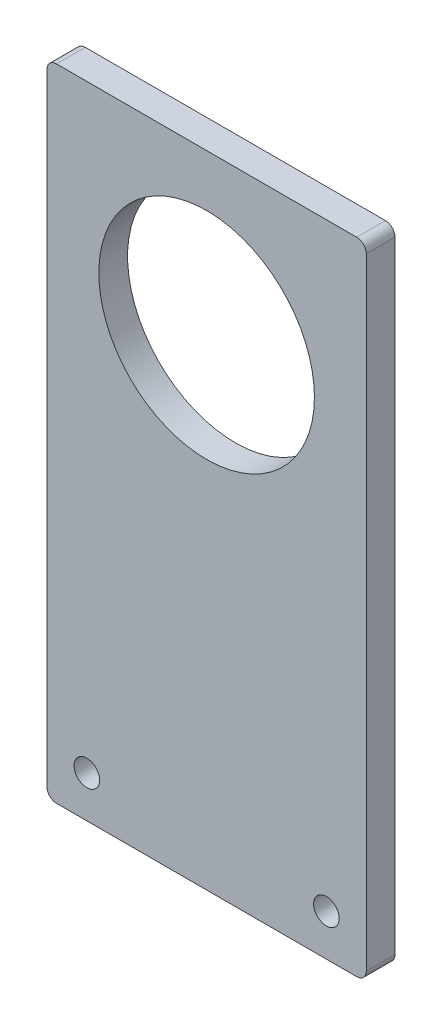
ISO-10303-21;
HEADER;
FILE_DESCRIPTION(('STEP AP214'),'2;1');
FILE_NAME('part.step','',(''),(''),'','','');
FILE_SCHEMA(('AUTOMOTIVE_DESIGN { 1 0 10303 214 1 1 1 1 }'));
ENDSEC;
DATA;
#1=APPLICATION_CONTEXT('core data for automotive mechanical design processes');
#2=APPLICATION_PROTOCOL_DEFINITION('international standard','automotive_design',2000,#1);
#3=PRODUCT_CONTEXT('',#1,'mechanical');
#4=PRODUCT('Part','Part','',(#3));
#5=PRODUCT_RELATED_PRODUCT_CATEGORY('part','',(#4));
#6=PRODUCT_DEFINITION_FORMATION('','',#4);
#7=PRODUCT_DEFINITION_CONTEXT('part definition',#1,'design');
#8=PRODUCT_DEFINITION('design','',#6,#7);
#9=PRODUCT_DEFINITION_SHAPE('','',#8);
#10=(LENGTH_UNIT() NAMED_UNIT(*) SI_UNIT(.MILLI.,.METRE.));
#11=(NAMED_UNIT(*) PLANE_ANGLE_UNIT() SI_UNIT($,.RADIAN.));
#12=(NAMED_UNIT(*) SI_UNIT($,.STERADIAN.) SOLID_ANGLE_UNIT());
#13=UNCERTAINTY_MEASURE_WITH_UNIT(LENGTH_MEASURE(1.E-05),#10,'distance_accuracy_value','');
#14=(GEOMETRIC_REPRESENTATION_CONTEXT(3) GLOBAL_UNCERTAINTY_ASSIGNED_CONTEXT((#13)) GLOBAL_UNIT_ASSIGNED_CONTEXT((#10,
#11,#12)) REPRESENTATION_CONTEXT('',''));
#15=CARTESIAN_POINT('',(0.,0.,0.));
#16=DIRECTION('',(0.,0.,1.));
#17=DIRECTION('',(1.,0.,0.));
#18=AXIS2_PLACEMENT_3D('',#15,#16,#17);
#19=CARTESIAN_POINT('',(19.5,-39.6,1.8));
#20=DIRECTION('',(0.,0.,1.));
#21=DIRECTION('',(1.,0.,0.));
#22=AXIS2_PLACEMENT_3D('',#19,#20,#21);
#23=PLANE('',#22);
#24=CARTESIAN_POINT('',(10.1,-10.1,1.8));
#25=DIRECTION('',(0.,0.,1.));
#26=DIRECTION('',(1.,0.,0.));
#27=AXIS2_PLACEMENT_3D('',#24,#25,#26);
#28=CIRCLE('',#27,6.75);
#29=CARTESIAN_POINT('',(16.85,-10.1,1.8));
#30=VERTEX_POINT('',#29);
#31=EDGE_CURVE('E11',#30,#30,#28,.T.);
#32=ORIENTED_EDGE('',*,*,#31,.F.);
#33=EDGE_LOOP('',(#32));
#34=FACE_BOUND('',#33,.T.);
#35=CARTESIAN_POINT('',(17.6,-37.6,1.8));
#36=DIRECTION('',(0.,0.,1.));
#37=DIRECTION('',(1.,0.,0.));
#38=AXIS2_PLACEMENT_3D('',#35,#36,#37);
#39=CIRCLE('',#38,0.8);
#40=CARTESIAN_POINT('',(18.4,-37.6,1.8));
#41=VERTEX_POINT('',#40);
#42=EDGE_CURVE('E183',#41,#41,#39,.T.);
#43=ORIENTED_EDGE('',*,*,#42,.F.);
#44=EDGE_LOOP('',(#43));
#45=FACE_BOUND('',#44,.T.);
#46=CARTESIAN_POINT('',(2.6,-37.6,1.8));
#47=DIRECTION('',(0.,0.,1.));
#48=DIRECTION('',(-1.,0.,0.));
#49=AXIS2_PLACEMENT_3D('',#46,#47,#48);
#50=CIRCLE('',#49,0.8);
#51=CARTESIAN_POINT('',(1.8,-37.6,1.8));
#52=VERTEX_POINT('',#51);
#53=EDGE_CURVE('E186',#52,#52,#50,.T.);
#54=ORIENTED_EDGE('',*,*,#53,.F.);
#55=EDGE_LOOP('',(#54));
#56=FACE_BOUND('',#55,.T.);
#57=DIRECTION('',(-1.,0.,0.));
#58=VECTOR('',#57,1.);
#59=CARTESIAN_POINT('',(19.5,-0.100000000000003,1.8));
#60=LINE('',#59,#58);
#61=CARTESIAN_POINT('',(19.5,-0.1,1.8));
#62=VERTEX_POINT('',#61);
#63=CARTESIAN_POINT('',(0.700000000000006,-0.100000000000003,1.8));
#64=VERTEX_POINT('',#63);
#65=EDGE_CURVE('E140',#62,#64,#60,.T.);
#66=ORIENTED_EDGE('',*,*,#65,.T.);
#67=CARTESIAN_POINT('',(0.7,-0.7,1.8));
#68=DIRECTION('',(0.,0.,1.));
#69=DIRECTION('',(1.,0.,0.));
#70=AXIS2_PLACEMENT_3D('',#67,#68,#69);
#71=CIRCLE('',#70,0.599999999999997);
#72=CARTESIAN_POINT('',(0.100000000000005,-0.700000000000006,1.8));
#73=VERTEX_POINT('',#72);
#74=EDGE_CURVE('E167',#64,#73,#71,.T.);
#75=ORIENTED_EDGE('',*,*,#74,.T.);
#76=DIRECTION('',(0.,-1.,0.));
#77=VECTOR('',#76,1.);
#78=CARTESIAN_POINT('',(0.100000000000006,-39.6,1.8));
#79=LINE('',#78,#77);
#80=CARTESIAN_POINT('',(0.100000000000007,-39.6,1.8));
#81=VERTEX_POINT('',#80);
#82=EDGE_CURVE('E164',#73,#81,#79,.T.);
#83=ORIENTED_EDGE('',*,*,#82,.T.);
#84=CARTESIAN_POINT('',(0.700000000000005,-39.6,1.8));
#85=DIRECTION('',(0.,0.,1.));
#86=DIRECTION('',(1.,0.,0.));
#87=AXIS2_PLACEMENT_3D('',#84,#85,#86);
#88=CIRCLE('',#87,0.599999999999998);
#89=CARTESIAN_POINT('',(0.700000000000006,-40.2,1.8));
#90=VERTEX_POINT('',#89);
#91=EDGE_CURVE('E161',#81,#90,#88,.T.);
#92=ORIENTED_EDGE('',*,*,#91,.T.);
#93=DIRECTION('',(1.,0.,0.));
#94=VECTOR('',#93,1.);
#95=CARTESIAN_POINT('',(19.5,-40.2,1.8));
#96=LINE('',#95,#94);
#97=CARTESIAN_POINT('',(19.5,-40.2,1.8));
#98=VERTEX_POINT('',#97);
#99=EDGE_CURVE('E158',#90,#98,#96,.T.);
#100=ORIENTED_EDGE('',*,*,#99,.T.);
#101=CARTESIAN_POINT('',(19.5,-39.6,1.8));
#102=DIRECTION('',(0.,0.,1.));
#103=DIRECTION('',(1.,0.,0.));
#104=AXIS2_PLACEMENT_3D('',#101,#102,#103);
#105=CIRCLE('',#104,0.6);
#106=CARTESIAN_POINT('',(20.1,-39.6,1.8));
#107=VERTEX_POINT('',#106);
#108=EDGE_CURVE('E155',#98,#107,#105,.T.);
#109=ORIENTED_EDGE('',*,*,#108,.T.);
#110=DIRECTION('',(0.,1.,0.));
#111=VECTOR('',#110,1.);
#112=CARTESIAN_POINT('',(20.1,-39.6,1.8));
#113=LINE('',#112,#111);
#114=CARTESIAN_POINT('',(20.1,-0.7,1.8));
#115=VERTEX_POINT('',#114);
#116=EDGE_CURVE('E153',#107,#115,#113,.T.);
#117=ORIENTED_EDGE('',*,*,#116,.T.);
#118=CARTESIAN_POINT('',(19.5,-0.7,1.8));
#119=DIRECTION('',(0.,0.,1.));
#120=DIRECTION('',(1.,0.,0.));
#121=AXIS2_PLACEMENT_3D('',#118,#119,#120);
#122=CIRCLE('',#121,0.6);
#123=EDGE_CURVE('E105',#115,#62,#122,.T.);
#124=ORIENTED_EDGE('',*,*,#123,.T.);
#125=EDGE_LOOP('',(#66,#75,#83,#92,#100,#109,#117,#124));
#126=FACE_BOUND('',#125,.T.);
#127=ADVANCED_FACE('F35',(#34,#45,#56,#126),#23,.T.);
#128=CARTESIAN_POINT('',(19.5,-39.6,0.));
#129=DIRECTION('',(0.,0.,1.));
#130=DIRECTION('',(1.,0.,0.));
#131=AXIS2_PLACEMENT_3D('',#128,#129,#130);
#132=PLANE('',#131);
#133=CARTESIAN_POINT('',(10.1,-10.1,0.));
#134=DIRECTION('',(0.,0.,1.));
#135=DIRECTION('',(1.,0.,0.));
#136=AXIS2_PLACEMENT_3D('',#133,#134,#135);
#137=CIRCLE('',#136,6.75);
#138=CARTESIAN_POINT('',(16.85,-10.1,0.));
#139=VERTEX_POINT('',#138);
#140=EDGE_CURVE('E44',#139,#139,#137,.T.);
#141=ORIENTED_EDGE('',*,*,#140,.T.);
#142=EDGE_LOOP('',(#141));
#143=FACE_BOUND('',#142,.T.);
#144=CARTESIAN_POINT('',(2.6,-37.6,0.));
#145=DIRECTION('',(0.,0.,-1.));
#146=DIRECTION('',(-1.,0.,0.));
#147=AXIS2_PLACEMENT_3D('',#144,#145,#146);
#148=CIRCLE('',#147,1.75);
#149=CARTESIAN_POINT('',(0.850000000000001,-37.6,0.));
#150=VERTEX_POINT('',#149);
#151=EDGE_CURVE('E170',#150,#150,#148,.T.);
#152=ORIENTED_EDGE('',*,*,#151,.F.);
#153=EDGE_LOOP('',(#152));
#154=FACE_BOUND('',#153,.T.);
#155=CARTESIAN_POINT('',(17.6,-37.6,0.));
#156=DIRECTION('',(0.,0.,-1.));
#157=DIRECTION('',(-1.,0.,0.));
#158=AXIS2_PLACEMENT_3D('',#155,#156,#157);
#159=CIRCLE('',#158,1.75);
#160=CARTESIAN_POINT('',(15.85,-37.6,0.));
#161=VERTEX_POINT('',#160);
#162=EDGE_CURVE('E174',#161,#161,#159,.T.);
#163=ORIENTED_EDGE('',*,*,#162,.F.);
#164=EDGE_LOOP('',(#163));
#165=FACE_BOUND('',#164,.T.);
#166=CARTESIAN_POINT('',(0.7,-0.7,0.));
#167=DIRECTION('',(0.,0.,-1.));
#168=DIRECTION('',(-1.,0.,0.));
#169=AXIS2_PLACEMENT_3D('',#166,#167,#168);
#170=CIRCLE('',#169,0.599999999999997);
#171=CARTESIAN_POINT('',(0.100000000000005,-0.700000000000006,0.));
#172=VERTEX_POINT('',#171);
#173=CARTESIAN_POINT('',(0.700000000000006,-0.100000000000003,0.));
#174=VERTEX_POINT('',#173);
#175=EDGE_CURVE('E124',#172,#174,#170,.T.);
#176=ORIENTED_EDGE('',*,*,#175,.T.);
#177=DIRECTION('',(1.,0.,0.));
#178=VECTOR('',#177,1.);
#179=CARTESIAN_POINT('',(0.700000000000005,-0.1,0.));
#180=LINE('',#179,#178);
#181=CARTESIAN_POINT('',(19.5,-0.100000000000003,0.));
#182=VERTEX_POINT('',#181);
#183=EDGE_CURVE('E122',#174,#182,#180,.T.);
#184=ORIENTED_EDGE('',*,*,#183,.T.);
#185=CARTESIAN_POINT('',(19.5,-0.7,0.));
#186=DIRECTION('',(0.,0.,-1.));
#187=DIRECTION('',(-1.,0.,0.));
#188=AXIS2_PLACEMENT_3D('',#185,#186,#187);
#189=CIRCLE('',#188,0.6);
#190=CARTESIAN_POINT('',(20.1,-0.7,0.));
#191=VERTEX_POINT('',#190);
#192=EDGE_CURVE('E60',#182,#191,#189,.T.);
#193=ORIENTED_EDGE('',*,*,#192,.T.);
#194=DIRECTION('',(0.,-1.,0.));
#195=VECTOR('',#194,1.);
#196=CARTESIAN_POINT('',(20.1,-0.7,0.));
#197=LINE('',#196,#195);
#198=CARTESIAN_POINT('',(20.1,-39.6,0.));
#199=VERTEX_POINT('',#198);
#200=EDGE_CURVE('E112',#191,#199,#197,.T.);
#201=ORIENTED_EDGE('',*,*,#200,.T.);
#202=CARTESIAN_POINT('',(19.5,-39.6,0.));
#203=DIRECTION('',(0.,0.,-1.));
#204=DIRECTION('',(-1.,0.,0.));
#205=AXIS2_PLACEMENT_3D('',#202,#203,#204);
#206=CIRCLE('',#205,0.6);
#207=CARTESIAN_POINT('',(19.5,-40.2,0.));
#208=VERTEX_POINT('',#207);
#209=EDGE_CURVE('E118',#199,#208,#206,.T.);
#210=ORIENTED_EDGE('',*,*,#209,.T.);
#211=DIRECTION('',(-1.,0.,0.));
#212=VECTOR('',#211,1.);
#213=CARTESIAN_POINT('',(19.5,-40.2,0.));
#214=LINE('',#213,#212);
#215=CARTESIAN_POINT('',(0.700000000000006,-40.2,0.));
#216=VERTEX_POINT('',#215);
#217=EDGE_CURVE('E129',#208,#216,#214,.T.);
#218=ORIENTED_EDGE('',*,*,#217,.T.);
#219=CARTESIAN_POINT('',(0.700000000000005,-39.6,0.));
#220=DIRECTION('',(0.,0.,-1.));
#221=DIRECTION('',(-1.,0.,0.));
#222=AXIS2_PLACEMENT_3D('',#219,#220,#221);
#223=CIRCLE('',#222,0.599999999999998);
#224=CARTESIAN_POINT('',(0.100000000000007,-39.6,0.));
#225=VERTEX_POINT('',#224);
#226=EDGE_CURVE('E132',#216,#225,#223,.T.);
#227=ORIENTED_EDGE('',*,*,#226,.T.);
#228=DIRECTION('',(0.,1.,0.));
#229=VECTOR('',#228,1.);
#230=CARTESIAN_POINT('',(0.100000000000005,-39.6,0.));
#231=LINE('',#230,#229);
#232=EDGE_CURVE('E135',#225,#172,#231,.T.);
#233=ORIENTED_EDGE('',*,*,#232,.T.);
#234=EDGE_LOOP('',(#176,#184,#193,#201,#210,#218,#227,#233));
#235=FACE_BOUND('',#234,.T.);
#236=ADVANCED_FACE('F37',(#143,#154,#165,#235),#132,.F.);
#237=CARTESIAN_POINT('',(17.6,-37.6,-0.2));
#238=DIRECTION('',(0.,0.,1.));
#239=DIRECTION('',(1.,0.,0.));
#240=AXIS2_PLACEMENT_3D('',#237,#238,#239);
#241=CYLINDRICAL_SURFACE('',#240,0.8);
#242=ORIENTED_EDGE('',*,*,#42,.T.);
#243=EDGE_LOOP('',(#242));
#244=FACE_BOUND('',#243,.T.);
#245=CARTESIAN_POINT('',(17.6,-37.6,0.5));
#246=DIRECTION('',(0.,0.,-1.));
#247=DIRECTION('',(-1.,0.,0.));
#248=AXIS2_PLACEMENT_3D('',#245,#246,#247);
#249=CIRCLE('',#248,0.8);
#250=CARTESIAN_POINT('',(16.8,-37.6,0.5));
#251=VERTEX_POINT('',#250);
#252=EDGE_CURVE('E39',#251,#251,#249,.F.);
#253=ORIENTED_EDGE('',*,*,#252,.F.);
#254=EDGE_LOOP('',(#253));
#255=FACE_BOUND('',#254,.T.);
#256=ADVANCED_FACE('F198',(#244,#255),#241,.F.);
#257=CARTESIAN_POINT('',(2.6,-37.6,-0.2));
#258=DIRECTION('',(0.,0.,1.));
#259=DIRECTION('',(1.,0.,0.));
#260=AXIS2_PLACEMENT_3D('',#257,#258,#259);
#261=CYLINDRICAL_SURFACE('',#260,0.8);
#262=ORIENTED_EDGE('',*,*,#53,.T.);
#263=EDGE_LOOP('',(#262));
#264=FACE_BOUND('',#263,.T.);
#265=CARTESIAN_POINT('',(2.6,-37.6,0.5));
#266=DIRECTION('',(0.,0.,-1.));
#267=DIRECTION('',(-1.,0.,0.));
#268=AXIS2_PLACEMENT_3D('',#265,#266,#267);
#269=CIRCLE('',#268,0.8);
#270=CARTESIAN_POINT('',(1.8,-37.6,0.5));
#271=VERTEX_POINT('',#270);
#272=EDGE_CURVE('E180',#271,#271,#269,.F.);
#273=ORIENTED_EDGE('',*,*,#272,.F.);
#274=EDGE_LOOP('',(#273));
#275=FACE_BOUND('',#274,.T.);
#276=ADVANCED_FACE('F200',(#264,#275),#261,.F.);
#277=CARTESIAN_POINT('',(10.1,-10.1,1.8));
#278=DIRECTION('',(0.,0.,-1.));
#279=DIRECTION('',(-1.,0.,0.));
#280=AXIS2_PLACEMENT_3D('',#277,#278,#279);
#281=CYLINDRICAL_SURFACE('',#280,6.75);
#282=ORIENTED_EDGE('',*,*,#31,.T.);
#283=EDGE_LOOP('',(#282));
#284=FACE_BOUND('',#283,.T.);
#285=ORIENTED_EDGE('',*,*,#140,.F.);
#286=EDGE_LOOP('',(#285));
#287=FACE_BOUND('',#286,.T.);
#288=ADVANCED_FACE('F207',(#284,#287),#281,.F.);
#289=CARTESIAN_POINT('',(2.6,-37.6,0.5));
#290=DIRECTION('',(0.,0.,-1.));
#291=DIRECTION('',(-1.,0.,0.));
#292=AXIS2_PLACEMENT_3D('',#289,#290,#291);
#293=PLANE('',#292);
#294=CARTESIAN_POINT('',(2.6,-37.6,0.5));
#295=DIRECTION('',(0.,0.,-1.));
#296=DIRECTION('',(-1.,0.,0.));
#297=AXIS2_PLACEMENT_3D('',#294,#295,#296);
#298=CIRCLE('',#297,1.75);
#299=CARTESIAN_POINT('',(0.850000000000001,-37.6,0.5));
#300=VERTEX_POINT('',#299);
#301=EDGE_CURVE('E171',#300,#300,#298,.T.);
#302=ORIENTED_EDGE('',*,*,#301,.T.);
#303=EDGE_LOOP('',(#302));
#304=FACE_BOUND('',#303,.T.);
#305=ORIENTED_EDGE('',*,*,#272,.T.);
#306=EDGE_LOOP('',(#305));
#307=FACE_BOUND('',#306,.T.);
#308=ADVANCED_FACE('F220',(#304,#307),#293,.T.);
#309=CARTESIAN_POINT('',(2.6,-37.6,0.5));
#310=DIRECTION('',(0.,0.,-1.));
#311=DIRECTION('',(-1.,0.,0.));
#312=AXIS2_PLACEMENT_3D('',#309,#310,#311);
#313=CYLINDRICAL_SURFACE('',#312,1.75);
#314=ORIENTED_EDGE('',*,*,#301,.F.);
#315=EDGE_LOOP('',(#314));
#316=FACE_BOUND('',#315,.T.);
#317=ORIENTED_EDGE('',*,*,#151,.T.);
#318=EDGE_LOOP('',(#317));
#319=FACE_BOUND('',#318,.T.);
#320=ADVANCED_FACE('F225',(#316,#319),#313,.F.);
#321=CARTESIAN_POINT('',(17.6,-37.6,0.5));
#322=DIRECTION('',(0.,0.,-1.));
#323=DIRECTION('',(-1.,0.,0.));
#324=AXIS2_PLACEMENT_3D('',#321,#322,#323);
#325=PLANE('',#324);
#326=CARTESIAN_POINT('',(17.6,-37.6,0.5));
#327=DIRECTION('',(0.,0.,-1.));
#328=DIRECTION('',(-1.,0.,0.));
#329=AXIS2_PLACEMENT_3D('',#326,#327,#328);
#330=CIRCLE('',#329,1.75);
#331=CARTESIAN_POINT('',(15.85,-37.6,0.5));
#332=VERTEX_POINT('',#331);
#333=EDGE_CURVE('E177',#332,#332,#330,.T.);
#334=ORIENTED_EDGE('',*,*,#333,.T.);
#335=EDGE_LOOP('',(#334));
#336=FACE_BOUND('',#335,.T.);
#337=ORIENTED_EDGE('',*,*,#252,.T.);
#338=EDGE_LOOP('',(#337));
#339=FACE_BOUND('',#338,.T.);
#340=ADVANCED_FACE('F196',(#336,#339),#325,.T.);
#341=CARTESIAN_POINT('',(17.6,-37.6,0.5));
#342=DIRECTION('',(0.,0.,-1.));
#343=DIRECTION('',(-1.,0.,0.));
#344=AXIS2_PLACEMENT_3D('',#341,#342,#343);
#345=CYLINDRICAL_SURFACE('',#344,1.75);
#346=ORIENTED_EDGE('',*,*,#333,.F.);
#347=EDGE_LOOP('',(#346));
#348=FACE_BOUND('',#347,.T.);
#349=ORIENTED_EDGE('',*,*,#162,.T.);
#350=EDGE_LOOP('',(#349));
#351=FACE_BOUND('',#350,.T.);
#352=ADVANCED_FACE('F235',(#348,#351),#345,.F.);
#353=CARTESIAN_POINT('',(0.7,-0.7,10.));
#354=DIRECTION('',(0.,0.,-1.));
#355=DIRECTION('',(-1.,0.,0.));
#356=AXIS2_PLACEMENT_3D('',#353,#354,#355);
#357=CYLINDRICAL_SURFACE('',#356,0.599999999999997);
#358=DIRECTION('',(0.,0.,-1.));
#359=VECTOR('',#358,1.);
#360=CARTESIAN_POINT('',(0.700000000000005,-0.1,10.));
#361=LINE('',#360,#359);
#362=EDGE_CURVE('E52',#64,#174,#361,.T.);
#363=ORIENTED_EDGE('',*,*,#362,.T.);
#364=ORIENTED_EDGE('',*,*,#175,.F.);
#365=DIRECTION('',(0.,0.,-1.));
#366=VECTOR('',#365,1.);
#367=CARTESIAN_POINT('',(0.100000000000005,-0.700000000000006,10.));
#368=LINE('',#367,#366);
#369=EDGE_CURVE('E138',#73,#172,#368,.T.);
#370=ORIENTED_EDGE('',*,*,#369,.F.);
#371=ORIENTED_EDGE('',*,*,#74,.F.);
#372=EDGE_LOOP('',(#363,#364,#370,#371));
#373=FACE_BOUND('',#372,.T.);
#374=ADVANCED_FACE('F237',(#373),#357,.T.);
#375=CARTESIAN_POINT('',(0.100000000000005,-39.6,10.));
#376=DIRECTION('',(-1.,0.,0.));
#377=DIRECTION('',(0.,-1.,0.));
#378=AXIS2_PLACEMENT_3D('',#375,#376,#377);
#379=PLANE('',#378);
#380=ORIENTED_EDGE('',*,*,#369,.T.);
#381=ORIENTED_EDGE('',*,*,#232,.F.);
#382=DIRECTION('',(0.,0.,-1.));
#383=VECTOR('',#382,1.);
#384=CARTESIAN_POINT('',(0.100000000000007,-39.6,10.));
#385=LINE('',#384,#383);
#386=EDGE_CURVE('E141',#81,#225,#385,.T.);
#387=ORIENTED_EDGE('',*,*,#386,.F.);
#388=ORIENTED_EDGE('',*,*,#82,.F.);
#389=EDGE_LOOP('',(#380,#381,#387,#388));
#390=FACE_BOUND('',#389,.T.);
#391=ADVANCED_FACE('F243',(#390),#379,.T.);
#392=CARTESIAN_POINT('',(0.700000000000005,-39.6,10.));
#393=DIRECTION('',(0.,0.,-1.));
#394=DIRECTION('',(-1.,0.,0.));
#395=AXIS2_PLACEMENT_3D('',#392,#393,#394);
#396=CYLINDRICAL_SURFACE('',#395,0.599999999999998);
#397=ORIENTED_EDGE('',*,*,#386,.T.);
#398=ORIENTED_EDGE('',*,*,#226,.F.);
#399=DIRECTION('',(0.,0.,-1.));
#400=VECTOR('',#399,1.);
#401=CARTESIAN_POINT('',(0.700000000000006,-40.2,10.));
#402=LINE('',#401,#400);
#403=EDGE_CURVE('E143',#90,#216,#402,.T.);
#404=ORIENTED_EDGE('',*,*,#403,.F.);
#405=ORIENTED_EDGE('',*,*,#91,.F.);
#406=EDGE_LOOP('',(#397,#398,#404,#405));
#407=FACE_BOUND('',#406,.T.);
#408=ADVANCED_FACE('F267',(#407),#396,.T.);
#409=CARTESIAN_POINT('',(19.5,-40.2,10.));
#410=DIRECTION('',(0.,-1.,0.));
#411=DIRECTION('',(1.,0.,0.));
#412=AXIS2_PLACEMENT_3D('',#409,#410,#411);
#413=PLANE('',#412);
#414=ORIENTED_EDGE('',*,*,#403,.T.);
#415=ORIENTED_EDGE('',*,*,#217,.F.);
#416=DIRECTION('',(0.,0.,-1.));
#417=VECTOR('',#416,1.);
#418=CARTESIAN_POINT('',(19.5,-40.2,10.));
#419=LINE('',#418,#417);
#420=EDGE_CURVE('E145',#98,#208,#419,.T.);
#421=ORIENTED_EDGE('',*,*,#420,.F.);
#422=ORIENTED_EDGE('',*,*,#99,.F.);
#423=EDGE_LOOP('',(#414,#415,#421,#422));
#424=FACE_BOUND('',#423,.T.);
#425=ADVANCED_FACE('F263',(#424),#413,.T.);
#426=CARTESIAN_POINT('',(19.5,-39.6,10.));
#427=DIRECTION('',(0.,0.,-1.));
#428=DIRECTION('',(-1.,0.,0.));
#429=AXIS2_PLACEMENT_3D('',#426,#427,#428);
#430=CYLINDRICAL_SURFACE('',#429,0.6);
#431=ORIENTED_EDGE('',*,*,#420,.T.);
#432=ORIENTED_EDGE('',*,*,#209,.F.);
#433=DIRECTION('',(0.,0.,-1.));
#434=VECTOR('',#433,1.);
#435=CARTESIAN_POINT('',(20.1,-39.6,10.));
#436=LINE('',#435,#434);
#437=EDGE_CURVE('E108',#107,#199,#436,.T.);
#438=ORIENTED_EDGE('',*,*,#437,.F.);
#439=ORIENTED_EDGE('',*,*,#108,.F.);
#440=EDGE_LOOP('',(#431,#432,#438,#439));
#441=FACE_BOUND('',#440,.T.);
#442=ADVANCED_FACE('F260',(#441),#430,.T.);
#443=CARTESIAN_POINT('',(20.1,-0.7,10.));
#444=DIRECTION('',(1.,0.,0.));
#445=DIRECTION('',(0.,0.,-1.));
#446=AXIS2_PLACEMENT_3D('',#443,#444,#445);
#447=PLANE('',#446);
#448=ORIENTED_EDGE('',*,*,#437,.T.);
#449=ORIENTED_EDGE('',*,*,#200,.F.);
#450=DIRECTION('',(0.,0.,-1.));
#451=VECTOR('',#450,1.);
#452=CARTESIAN_POINT('',(20.1,-0.7,10.));
#453=LINE('',#452,#451);
#454=EDGE_CURVE('E101',#115,#191,#453,.T.);
#455=ORIENTED_EDGE('',*,*,#454,.F.);
#456=ORIENTED_EDGE('',*,*,#116,.F.);
#457=EDGE_LOOP('',(#448,#449,#455,#456));
#458=FACE_BOUND('',#457,.T.);
#459=ADVANCED_FACE('F113',(#458),#447,.T.);
#460=CARTESIAN_POINT('',(19.5,-0.7,10.));
#461=DIRECTION('',(0.,0.,-1.));
#462=DIRECTION('',(-1.,0.,0.));
#463=AXIS2_PLACEMENT_3D('',#460,#461,#462);
#464=CYLINDRICAL_SURFACE('',#463,0.6);
#465=ORIENTED_EDGE('',*,*,#454,.T.);
#466=ORIENTED_EDGE('',*,*,#192,.F.);
#467=DIRECTION('',(0.,0.,-1.));
#468=VECTOR('',#467,1.);
#469=CARTESIAN_POINT('',(19.5,-0.1,10.));
#470=LINE('',#469,#468);
#471=EDGE_CURVE('E109',#62,#182,#470,.T.);
#472=ORIENTED_EDGE('',*,*,#471,.F.);
#473=ORIENTED_EDGE('',*,*,#123,.F.);
#474=EDGE_LOOP('',(#465,#466,#472,#473));
#475=FACE_BOUND('',#474,.T.);
#476=ADVANCED_FACE('F103',(#475),#464,.T.);
#477=CARTESIAN_POINT('',(0.700000000000005,-0.1,10.));
#478=DIRECTION('',(0.,1.,0.));
#479=DIRECTION('',(0.,0.,1.));
#480=AXIS2_PLACEMENT_3D('',#477,#478,#479);
#481=PLANE('',#480);
#482=ORIENTED_EDGE('',*,*,#471,.T.);
#483=ORIENTED_EDGE('',*,*,#183,.F.);
#484=ORIENTED_EDGE('',*,*,#362,.F.);
#485=ORIENTED_EDGE('',*,*,#65,.F.);
#486=EDGE_LOOP('',(#482,#483,#484,#485));
#487=FACE_BOUND('',#486,.T.);
#488=ADVANCED_FACE('F253',(#487),#481,.T.);
#489=CLOSED_SHELL('',(#127,#236,#256,#276,#288,#308,#320,#340,#352,#374,#391,#408,#425,#442,
#459,#476,#488));
#490=MANIFOLD_SOLID_BREP('B2',#489);
#491=ADVANCED_BREP_SHAPE_REPRESENTATION('',(#18,#490),#14);
#492=SHAPE_DEFINITION_REPRESENTATION(#9,#491);
ENDSEC;
END-ISO-10303-21;
